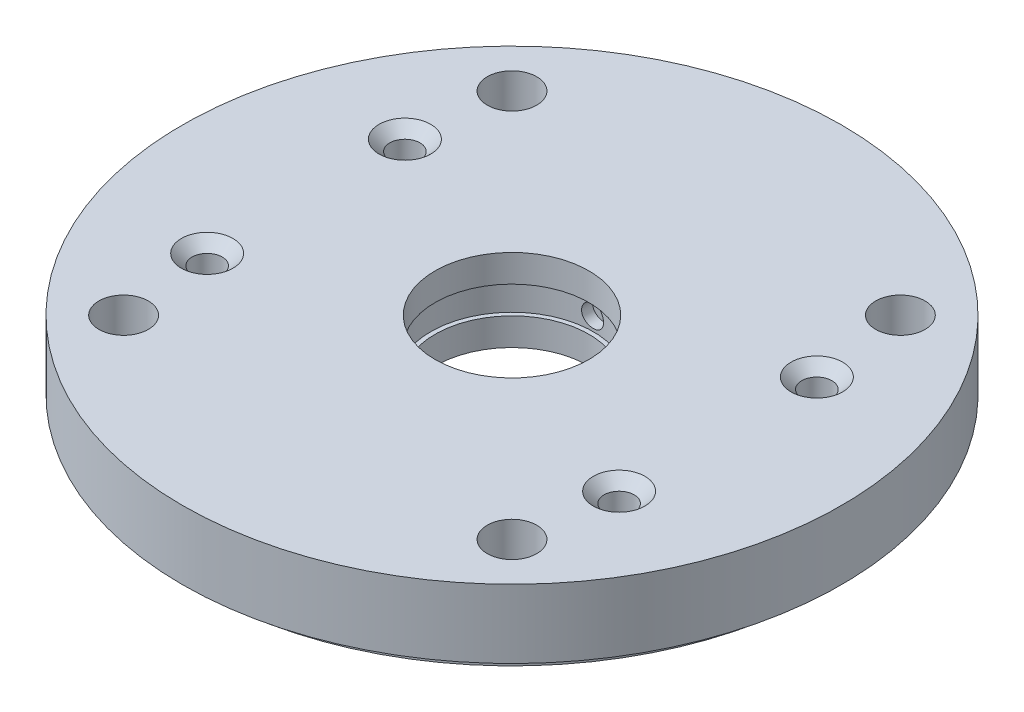
ISO-10303-21;
HEADER;
FILE_DESCRIPTION(('STEP AP214'),'2;1');
FILE_NAME('part.step','',(''),(''),'','','');
FILE_SCHEMA(('AUTOMOTIVE_DESIGN { 1 0 10303 214 1 1 1 1 }'));
ENDSEC;
DATA;
#1=APPLICATION_CONTEXT('core data for automotive mechanical design processes');
#2=APPLICATION_PROTOCOL_DEFINITION('international standard','automotive_design',2000,#1);
#3=PRODUCT_CONTEXT('',#1,'mechanical');
#4=PRODUCT('Part','Part','',(#3));
#5=PRODUCT_RELATED_PRODUCT_CATEGORY('part','',(#4));
#6=PRODUCT_DEFINITION_FORMATION('','',#4);
#7=PRODUCT_DEFINITION_CONTEXT('part definition',#1,'design');
#8=PRODUCT_DEFINITION('design','',#6,#7);
#9=PRODUCT_DEFINITION_SHAPE('','',#8);
#10=(LENGTH_UNIT() NAMED_UNIT(*) SI_UNIT(.MILLI.,.METRE.));
#11=(NAMED_UNIT(*) PLANE_ANGLE_UNIT() SI_UNIT($,.RADIAN.));
#12=(NAMED_UNIT(*) SI_UNIT($,.STERADIAN.) SOLID_ANGLE_UNIT());
#13=UNCERTAINTY_MEASURE_WITH_UNIT(LENGTH_MEASURE(1.E-05),#10,'distance_accuracy_value','');
#14=(GEOMETRIC_REPRESENTATION_CONTEXT(3) GLOBAL_UNCERTAINTY_ASSIGNED_CONTEXT((#13)) GLOBAL_UNIT_ASSIGNED_CONTEXT((#10,
#11,#12)) REPRESENTATION_CONTEXT('',''));
#15=CARTESIAN_POINT('',(0.,0.,0.));
#16=DIRECTION('',(0.,0.,1.));
#17=DIRECTION('',(1.,0.,0.));
#18=AXIS2_PLACEMENT_3D('',#15,#16,#17);
#19=CARTESIAN_POINT('',(0.,-2.5,0.));
#20=DIRECTION('',(0.,1.,0.));
#21=DIRECTION('',(0.,0.,1.));
#22=AXIS2_PLACEMENT_3D('',#19,#20,#21);
#23=CYLINDRICAL_SURFACE('',#22,14.8);
#24=CARTESIAN_POINT('',(0.,-2.5,0.));
#25=DIRECTION('',(0.,1.,0.));
#26=DIRECTION('',(0.,0.,1.));
#27=AXIS2_PLACEMENT_3D('',#24,#25,#26);
#28=CIRCLE('',#27,14.8);
#29=CARTESIAN_POINT('',(0.,-2.5,14.8));
#30=VERTEX_POINT('',#29);
#31=EDGE_CURVE('E59',#30,#30,#28,.T.);
#32=ORIENTED_EDGE('',*,*,#31,.F.);
#33=EDGE_LOOP('',(#32));
#34=FACE_BOUND('',#33,.T.);
#35=CARTESIAN_POINT('',(0.,2.5,0.));
#36=DIRECTION('',(0.,1.,0.));
#37=DIRECTION('',(0.,0.,1.));
#38=AXIS2_PLACEMENT_3D('',#35,#36,#37);
#39=CIRCLE('',#38,14.8);
#40=CARTESIAN_POINT('',(0.,2.5,14.8));
#41=VERTEX_POINT('',#40);
#42=EDGE_CURVE('E128',#41,#41,#39,.T.);
#43=ORIENTED_EDGE('',*,*,#42,.T.);
#44=EDGE_LOOP('',(#43));
#45=FACE_BOUND('',#44,.T.);
#46=CARTESIAN_POINT('',(-2.,0.,-14.6642422238587));
#47=CARTESIAN_POINT('',(-1.99999529578587,-0.111789206027057,-14.6642439407866));
#48=CARTESIAN_POINT('',(-1.99059572714212,-0.223646375467716,-14.6655343330712));
#49=CARTESIAN_POINT('',(-1.95325073253241,-0.444242193801103,-14.670553938447));
#50=CARTESIAN_POINT('',(-1.92528642224589,-0.552977549522505,-14.6742856348113));
#51=CARTESIAN_POINT('',(-1.8516561967299,-0.764104249434412,-14.6837576321533));
#52=CARTESIAN_POINT('',(-1.80600289769559,-0.866500054906773,-14.6894965012858));
#53=CARTESIAN_POINT('',(-1.69831872993679,-1.06216008351143,-14.7023345055794));
#54=CARTESIAN_POINT('',(-1.63629045083665,-1.15542574733752,-14.7094334256063));
#55=CARTESIAN_POINT('',(-1.49718446195897,-1.33080340222723,-14.7242434594185));
#56=CARTESIAN_POINT('',(-1.42002117228851,-1.41284724011534,-14.7319578991606));
#57=CARTESIAN_POINT('',(-1.25302005026385,-1.56286286381146,-14.7470999322923));
#58=CARTESIAN_POINT('',(-1.16318156288561,-1.63083392192353,-14.7545275108323));
#59=CARTESIAN_POINT('',(-0.972948400654116,-1.75102192358299,-14.7682933030086));
#60=CARTESIAN_POINT('',(-0.87251413147463,-1.80317673642567,-14.7746271793963));
#61=CARTESIAN_POINT('',(-0.664212082875051,-1.88985352912222,-14.7854552383821));
#62=CARTESIAN_POINT('',(-0.556344624248892,-1.92437626938271,-14.7899495003143));
#63=CARTESIAN_POINT('',(-0.336937385894213,-1.97460407507685,-14.796568506601));
#64=CARTESIAN_POINT('',(-0.2254240686656,-1.99042281921608,-14.7987075598605));
#65=CARTESIAN_POINT('',(-0.00130658082203191,-2.00314616261992,-14.8004240695127));
#66=CARTESIAN_POINT('',(0.111297539828156,-2.00005162416445,-14.8000016426865));
#67=CARTESIAN_POINT('',(0.333625960086138,-1.97512681206038,-14.7966543092344));
#68=CARTESIAN_POINT('',(0.44336424815575,-1.95341881198866,-14.7937457347353));
#69=CARTESIAN_POINT('',(0.657625951591038,-1.89207472982094,-14.7857711744686));
#70=CARTESIAN_POINT('',(0.762149253892653,-1.85243825921217,-14.7807051419487));
#71=CARTESIAN_POINT('',(0.963389245623299,-1.75623421281881,-14.7689567352304));
#72=CARTESIAN_POINT('',(1.06008060101127,-1.69961427684651,-14.762269374867));
#73=CARTESIAN_POINT('',(1.24263567066565,-1.57108867088602,-14.7480254013326));
#74=CARTESIAN_POINT('',(1.32849880469172,-1.49918218230769,-14.7404687416209));
#75=CARTESIAN_POINT('',(1.48767939507609,-1.34144118747187,-14.725259502793));
#76=CARTESIAN_POINT('',(1.56089118777377,-1.25550003995744,-14.7176066395955));
#77=CARTESIAN_POINT('',(1.6918681733103,-1.07249406202839,-14.7031268072317));
#78=CARTESIAN_POINT('',(1.74963330179108,-0.97542918526948,-14.6962998415067));
#79=CARTESIAN_POINT('',(1.8480863984276,-0.772830795802746,-14.6842449623788));
#80=CARTESIAN_POINT('',(1.88876498530745,-0.667292668677439,-14.6790179278359));
#81=CARTESIAN_POINT('',(1.9517917706359,-0.450796685786435,-14.6707712337009));
#82=CARTESIAN_POINT('',(1.97414100764296,-0.339839137467833,-14.6677514490448));
#83=CARTESIAN_POINT('',(1.99973284108136,-0.116589845541708,-14.6642843923551));
#84=CARTESIAN_POINT('',(2.00312455380969,-0.00431549598699867,-14.6638170440091));
#85=CARTESIAN_POINT('',(1.99109936375072,0.219199875164322,-14.6654546026568));
#86=CARTESIAN_POINT('',(1.97568293148719,0.330440922540928,-14.667559445302));
#87=CARTESIAN_POINT('',(1.92660497787309,0.548279318610916,-14.674085858685));
#88=CARTESIAN_POINT('',(1.89301646048659,0.654893416641846,-14.6784981571703));
#89=CARTESIAN_POINT('',(1.80862324181559,0.860977130088984,-14.6891347663274));
#90=CARTESIAN_POINT('',(1.75781784002699,0.960446454605884,-14.6953591507262));
#91=CARTESIAN_POINT('',(1.64006961992967,1.15008932533665,-14.7089663946664));
#92=CARTESIAN_POINT('',(1.5730294974432,1.24020195345439,-14.7163561420588));
#93=CARTESIAN_POINT('',(1.42485152792593,1.40795011125592,-14.7314401993318));
#94=CARTESIAN_POINT('',(1.34371303775914,1.48558507142527,-14.739134523094));
#95=CARTESIAN_POINT('',(1.16898810331941,1.62670243514653,-14.7540228717902));
#96=CARTESIAN_POINT('',(1.07532189873812,1.69008652976689,-14.7612131992535));
#97=CARTESIAN_POINT('',(0.878585491628291,1.80022089364369,-14.7742273072731));
#98=CARTESIAN_POINT('',(0.775515505547851,1.84697154563299,-14.7800511192716));
#99=CARTESIAN_POINT('',(0.563216372681455,1.92235161424481,-14.7896596863114));
#100=CARTESIAN_POINT('',(0.454007274180482,1.95103666399582,-14.7934506959679));
#101=CARTESIAN_POINT('',(0.232267848176888,1.98965191245769,-14.7985926004645));
#102=CARTESIAN_POINT('',(0.119737697365194,1.99958310711509,-14.7999436248828));
#103=CARTESIAN_POINT('',(-0.104492116428674,2.00038793796832,-14.800052461997));
#104=CARTESIAN_POINT('',(-0.21619125683872,1.99141270529086,-14.7988308395213));
#105=CARTESIAN_POINT('',(-0.436477519972148,1.95498102415107,-14.7939727361505));
#106=CARTESIAN_POINT('',(-0.545064647578227,1.92752460468707,-14.7903362590445));
#107=CARTESIAN_POINT('',(-0.756016275547837,1.85495982137742,-14.7810551256117));
#108=CARTESIAN_POINT('',(-0.858383743191857,1.80985995250338,-14.7754114358368));
#109=CARTESIAN_POINT('',(-1.0541217593421,1.7033042484448,-14.7627388567654));
#110=CARTESIAN_POINT('',(-1.14749212852395,1.64184808734898,-14.7557099398681));
#111=CARTESIAN_POINT('',(-1.32335568077786,1.50376978983375,-14.74098329435));
#112=CARTESIAN_POINT('',(-1.40576040128395,1.42703547560042,-14.7332808703501));
#113=CARTESIAN_POINT('',(-1.55658079211531,1.26081397217681,-14.7181118753614));
#114=CARTESIAN_POINT('',(-1.62499315875848,1.17132377968802,-14.7106453604232));
#115=CARTESIAN_POINT('',(-1.74615707157483,0.981661686414926,-14.696757556328));
#116=CARTESIAN_POINT('',(-1.7988364821515,0.881443362349709,-14.6903411407858));
#117=CARTESIAN_POINT('',(-1.88654028972702,0.673547985707742,-14.6793370684491));
#118=CARTESIAN_POINT('',(-1.92158355240822,0.565879044077429,-14.674747458594));
#119=CARTESIAN_POINT('',(-1.96479702094079,0.381399961469509,-14.6690104760282));
#120=CARTESIAN_POINT('',(-1.97797869556822,0.305744766251739,-14.6672315043511));
#121=CARTESIAN_POINT('',(-1.99558175777549,0.153403710415408,-14.6648467946852));
#122=CARTESIAN_POINT('',(-2.00000322837286,0.076717859570962,-14.6642410455782));
#123=CARTESIAN_POINT('',(-2.,0.,-14.6642422238587));
#124=B_SPLINE_CURVE_WITH_KNOTS('',3,(#46,#47,#48,#49,#50,#51,#52,#53,#54,#55,#56,#57,#58,#59,
#60,#61,#62,#63,#64,#65,#66,#67,#68,#69,#70,#71,#72,#73,#74,#75,#76,#77,#78,#79,#80,#81,#82,#83,
#84,#85,#86,#87,#88,#89,#90,#91,#92,#93,#94,#95,#96,#97,#98,#99,#100,#101,#102,#103,#104,#105,
#106,#107,#108,#109,#110,#111,#112,#113,#114,#115,#116,#117,#118,#119,#120,#121,#122,#123),
.UNSPECIFIED.,.T.,.F.,(4,2,2,2,2,2,2,2,2,2,2,2,2,2,2,2,2,2,2,2,2,2,2,2,2,2,2,2,2,2,2,2,2,2,2,2,
2,2,4),(0.,0.335087300046434,0.670515979029476,1.00570586160471,1.3408427672339,
1.67793235102471,2.01503936118698,2.35345396302519,2.6918539690502,3.02818650705442,
3.36450371135731,3.69862839557102,4.03276032066605,4.36793315475953,4.70312394177703,
5.04099151075062,5.37886048741776,5.71691472755546,6.05494981189334,6.39032219395862,
6.72568618617755,7.05971279493041,7.39375299587,7.7298471274463,8.06595659491222,
8.40431803494195,8.7426716888251,9.07997821915832,9.41726683590973,9.75186952490266,
10.0864716888806,10.420912946428,10.7553608684646,11.0923615498155,11.4294417075121,
11.7680444528262,12.1062842151069,12.336247598554,12.5662088027042),.UNSPECIFIED.);
#125=CARTESIAN_POINT('',(-2.,0.,-14.6642422238587));
#126=VERTEX_POINT('',#125);
#127=EDGE_CURVE('E38',#126,#126,#124,.T.);
#128=ORIENTED_EDGE('',*,*,#127,.F.);
#129=EDGE_LOOP('',(#128));
#130=FACE_BOUND('',#129,.T.);
#131=ADVANCED_FACE('F34',(#34,#45,#130),#23,.F.);
#132=CARTESIAN_POINT('',(0.,-7.5,0.));
#133=DIRECTION('',(0.,1.,0.));
#134=DIRECTION('',(0.,0.,1.));
#135=AXIS2_PLACEMENT_3D('',#132,#133,#134);
#136=CYLINDRICAL_SURFACE('',#135,14.);
#137=CARTESIAN_POINT('',(0.,-7.5,0.));
#138=DIRECTION('',(0.,1.,0.));
#139=DIRECTION('',(0.,0.,1.));
#140=AXIS2_PLACEMENT_3D('',#137,#138,#139);
#141=CIRCLE('',#140,14.);
#142=CARTESIAN_POINT('',(0.,-7.5,14.));
#143=VERTEX_POINT('',#142);
#144=EDGE_CURVE('E65',#143,#143,#141,.T.);
#145=ORIENTED_EDGE('',*,*,#144,.F.);
#146=EDGE_LOOP('',(#145));
#147=FACE_BOUND('',#146,.T.);
#148=CARTESIAN_POINT('',(0.,-2.5,0.));
#149=DIRECTION('',(0.,1.,0.));
#150=DIRECTION('',(0.,0.,1.));
#151=AXIS2_PLACEMENT_3D('',#148,#149,#150);
#152=CIRCLE('',#151,14.);
#153=CARTESIAN_POINT('',(0.,-2.5,14.));
#154=VERTEX_POINT('',#153);
#155=EDGE_CURVE('E58',#154,#154,#152,.F.);
#156=ORIENTED_EDGE('',*,*,#155,.F.);
#157=EDGE_LOOP('',(#156));
#158=FACE_BOUND('',#157,.T.);
#159=ADVANCED_FACE('F97',(#147,#158),#136,.F.);
#160=CARTESIAN_POINT('',(0.,7.5,0.));
#161=DIRECTION('',(0.,-1.,0.));
#162=DIRECTION('',(0.,0.,-1.));
#163=AXIS2_PLACEMENT_3D('',#160,#161,#162);
#164=CYLINDRICAL_SURFACE('',#163,57.);
#165=CARTESIAN_POINT('',(0.,-7.5,0.));
#166=DIRECTION('',(0.,1.,0.));
#167=DIRECTION('',(0.,0.,1.));
#168=AXIS2_PLACEMENT_3D('',#165,#166,#167);
#169=CIRCLE('',#168,57.);
#170=CARTESIAN_POINT('',(0.,-7.5,57.));
#171=VERTEX_POINT('',#170);
#172=EDGE_CURVE('E47',#171,#171,#169,.T.);
#173=ORIENTED_EDGE('',*,*,#172,.T.);
#174=EDGE_LOOP('',(#173));
#175=FACE_BOUND('',#174,.T.);
#176=CARTESIAN_POINT('',(0.,-5.,0.));
#177=DIRECTION('',(0.,1.,0.));
#178=DIRECTION('',(0.,0.,1.));
#179=AXIS2_PLACEMENT_3D('',#176,#177,#178);
#180=CIRCLE('',#179,57.);
#181=CARTESIAN_POINT('',(0.,-5.,57.));
#182=VERTEX_POINT('',#181);
#183=EDGE_CURVE('E12',#182,#182,#180,.T.);
#184=ORIENTED_EDGE('',*,*,#183,.F.);
#185=EDGE_LOOP('',(#184));
#186=FACE_BOUND('',#185,.T.);
#187=ADVANCED_FACE('F36',(#175,#186),#164,.T.);
#188=CARTESIAN_POINT('',(0.,-7.5,0.));
#189=DIRECTION('',(0.,1.,0.));
#190=DIRECTION('',(0.,0.,1.));
#191=AXIS2_PLACEMENT_3D('',#188,#189,#190);
#192=PLANE('',#191);
#193=CARTESIAN_POINT('',(37.4999999999999,-7.5,18.0000000000035));
#194=DIRECTION('',(0.,-1.,0.));
#195=DIRECTION('',(0.,0.,-1.));
#196=AXIS2_PLACEMENT_3D('',#193,#194,#195);
#197=CIRCLE('',#196,2.75);
#198=CARTESIAN_POINT('',(37.4999999999999,-7.5,15.2500000000035));
#199=VERTEX_POINT('',#198);
#200=EDGE_CURVE('E212',#199,#199,#197,.T.);
#201=ORIENTED_EDGE('',*,*,#200,.F.);
#202=EDGE_LOOP('',(#201));
#203=FACE_BOUND('',#202,.T.);
#204=CARTESIAN_POINT('',(37.5,-7.5,-17.9999999999965));
#205=DIRECTION('',(0.,-1.,0.));
#206=DIRECTION('',(0.,0.,-1.));
#207=AXIS2_PLACEMENT_3D('',#204,#205,#206);
#208=CIRCLE('',#207,2.75);
#209=CARTESIAN_POINT('',(37.5,-7.5,-20.7499999999965));
#210=VERTEX_POINT('',#209);
#211=EDGE_CURVE('E223',#210,#210,#208,.T.);
#212=ORIENTED_EDGE('',*,*,#211,.F.);
#213=EDGE_LOOP('',(#212));
#214=FACE_BOUND('',#213,.T.);
#215=CARTESIAN_POINT('',(-37.5000000000001,-7.5,-17.9999999999965));
#216=DIRECTION('',(0.,-1.,0.));
#217=DIRECTION('',(0.,0.,-1.));
#218=AXIS2_PLACEMENT_3D('',#215,#216,#217);
#219=CIRCLE('',#218,2.75);
#220=CARTESIAN_POINT('',(-37.5000000000001,-7.5,-20.7499999999965));
#221=VERTEX_POINT('',#220);
#222=EDGE_CURVE('E232',#221,#221,#219,.T.);
#223=ORIENTED_EDGE('',*,*,#222,.F.);
#224=EDGE_LOOP('',(#223));
#225=FACE_BOUND('',#224,.T.);
#226=CARTESIAN_POINT('',(-37.5,-7.5,18.0000000000035));
#227=DIRECTION('',(0.,-1.,0.));
#228=DIRECTION('',(0.,0.,-1.));
#229=AXIS2_PLACEMENT_3D('',#226,#227,#228);
#230=CIRCLE('',#229,2.75);
#231=CARTESIAN_POINT('',(-37.5,-7.5,15.2500000000035));
#232=VERTEX_POINT('',#231);
#233=EDGE_CURVE('E241',#232,#232,#230,.T.);
#234=ORIENTED_EDGE('',*,*,#233,.F.);
#235=EDGE_LOOP('',(#234));
#236=FACE_BOUND('',#235,.T.);
#237=CARTESIAN_POINT('',(35.3553390593272,-7.5,35.3553390593275));
#238=DIRECTION('',(0.,1.,0.));
#239=DIRECTION('',(0.,0.,1.));
#240=AXIS2_PLACEMENT_3D('',#237,#238,#239);
#241=CIRCLE('',#240,4.49999999999999);
#242=CARTESIAN_POINT('',(35.3553390593272,-7.5,39.8553390593275));
#243=VERTEX_POINT('',#242);
#244=EDGE_CURVE('E250',#243,#243,#241,.T.);
#245=ORIENTED_EDGE('',*,*,#244,.T.);
#246=EDGE_LOOP('',(#245));
#247=FACE_BOUND('',#246,.T.);
#248=CARTESIAN_POINT('',(35.3553390593272,-7.5,-35.3553390593276));
#249=DIRECTION('',(0.,1.,0.));
#250=DIRECTION('',(0.,0.,1.));
#251=AXIS2_PLACEMENT_3D('',#248,#249,#250);
#252=CIRCLE('',#251,4.49999999999998);
#253=CARTESIAN_POINT('',(35.3553390593272,-7.5,-30.8553390593276));
#254=VERTEX_POINT('',#253);
#255=EDGE_CURVE('E256',#254,#254,#252,.T.);
#256=ORIENTED_EDGE('',*,*,#255,.T.);
#257=EDGE_LOOP('',(#256));
#258=FACE_BOUND('',#257,.T.);
#259=CARTESIAN_POINT('',(-35.3553390593275,-7.5,-35.3553390593273));
#260=DIRECTION('',(0.,1.,0.));
#261=DIRECTION('',(0.,0.,1.));
#262=AXIS2_PLACEMENT_3D('',#259,#260,#261);
#263=CIRCLE('',#262,4.49999999999999);
#264=CARTESIAN_POINT('',(-35.3553390593275,-7.5,-30.8553390593273));
#265=VERTEX_POINT('',#264);
#266=EDGE_CURVE('E262',#265,#265,#263,.T.);
#267=ORIENTED_EDGE('',*,*,#266,.T.);
#268=EDGE_LOOP('',(#267));
#269=FACE_BOUND('',#268,.T.);
#270=CARTESIAN_POINT('',(-35.3553390593272,-7.5,35.3553390593276));
#271=DIRECTION('',(0.,1.,0.));
#272=DIRECTION('',(0.,0.,1.));
#273=AXIS2_PLACEMENT_3D('',#270,#271,#272);
#274=CIRCLE('',#273,4.49999999999999);
#275=CARTESIAN_POINT('',(-35.3553390593272,-7.5,39.8553390593276));
#276=VERTEX_POINT('',#275);
#277=EDGE_CURVE('E140',#276,#276,#274,.T.);
#278=ORIENTED_EDGE('',*,*,#277,.T.);
#279=EDGE_LOOP('',(#278));
#280=FACE_BOUND('',#279,.T.);
#281=ORIENTED_EDGE('',*,*,#144,.T.);
#282=EDGE_LOOP('',(#281));
#283=FACE_BOUND('',#282,.T.);
#284=ORIENTED_EDGE('',*,*,#172,.F.);
#285=EDGE_LOOP('',(#284));
#286=FACE_BOUND('',#285,.T.);
#287=ADVANCED_FACE('F93',(#203,#214,#225,#236,#247,#258,#269,#280,#283,#286),#192,.F.);
#288=CARTESIAN_POINT('',(0.,-5.,0.));
#289=DIRECTION('',(0.,1.,0.));
#290=DIRECTION('',(0.,0.,1.));
#291=AXIS2_PLACEMENT_3D('',#288,#289,#290);
#292=CYLINDRICAL_SURFACE('',#291,60.);
#293=CARTESIAN_POINT('',(0.,-5.,0.));
#294=DIRECTION('',(0.,1.,0.));
#295=DIRECTION('',(0.,0.,1.));
#296=AXIS2_PLACEMENT_3D('',#293,#294,#295);
#297=CIRCLE('',#296,60.);
#298=CARTESIAN_POINT('',(0.,-5.,60.));
#299=VERTEX_POINT('',#298);
#300=EDGE_CURVE('E52',#299,#299,#297,.T.);
#301=ORIENTED_EDGE('',*,*,#300,.T.);
#302=EDGE_LOOP('',(#301));
#303=FACE_BOUND('',#302,.T.);
#304=CARTESIAN_POINT('',(0.,7.5,0.));
#305=DIRECTION('',(0.,1.,0.));
#306=DIRECTION('',(0.,0.,1.));
#307=AXIS2_PLACEMENT_3D('',#304,#305,#306);
#308=CIRCLE('',#307,60.);
#309=CARTESIAN_POINT('',(0.,7.5,60.));
#310=VERTEX_POINT('',#309);
#311=EDGE_CURVE('E70',#310,#310,#308,.T.);
#312=ORIENTED_EDGE('',*,*,#311,.F.);
#313=EDGE_LOOP('',(#312));
#314=FACE_BOUND('',#313,.T.);
#315=ADVANCED_FACE('F78',(#303,#314),#292,.T.);
#316=CARTESIAN_POINT('',(0.,-5.,0.));
#317=DIRECTION('',(0.,1.,0.));
#318=DIRECTION('',(0.,0.,1.));
#319=AXIS2_PLACEMENT_3D('',#316,#317,#318);
#320=PLANE('',#319);
#321=ORIENTED_EDGE('',*,*,#183,.T.);
#322=EDGE_LOOP('',(#321));
#323=FACE_BOUND('',#322,.T.);
#324=ORIENTED_EDGE('',*,*,#300,.F.);
#325=EDGE_LOOP('',(#324));
#326=FACE_BOUND('',#325,.T.);
#327=ADVANCED_FACE('F81',(#323,#326),#320,.F.);
#328=CARTESIAN_POINT('',(0.,7.5,0.));
#329=DIRECTION('',(0.,1.,0.));
#330=DIRECTION('',(0.,0.,1.));
#331=AXIS2_PLACEMENT_3D('',#328,#329,#330);
#332=PLANE('',#331);
#333=CARTESIAN_POINT('',(37.4999999999999,7.5,18.0000000000035));
#334=DIRECTION('',(0.,-1.,0.));
#335=DIRECTION('',(0.,0.,-1.));
#336=AXIS2_PLACEMENT_3D('',#333,#334,#335);
#337=CIRCLE('',#336,4.7);
#338=CARTESIAN_POINT('',(37.4999999999999,7.5,13.3000000000035));
#339=VERTEX_POINT('',#338);
#340=EDGE_CURVE('E214',#339,#339,#337,.T.);
#341=ORIENTED_EDGE('',*,*,#340,.T.);
#342=EDGE_LOOP('',(#341));
#343=FACE_BOUND('',#342,.T.);
#344=CARTESIAN_POINT('',(37.5,7.5,-17.9999999999965));
#345=DIRECTION('',(0.,-1.,0.));
#346=DIRECTION('',(0.,0.,-1.));
#347=AXIS2_PLACEMENT_3D('',#344,#345,#346);
#348=CIRCLE('',#347,4.7);
#349=CARTESIAN_POINT('',(37.5,7.5,-22.6999999999965));
#350=VERTEX_POINT('',#349);
#351=EDGE_CURVE('E216',#350,#350,#348,.T.);
#352=ORIENTED_EDGE('',*,*,#351,.T.);
#353=EDGE_LOOP('',(#352));
#354=FACE_BOUND('',#353,.T.);
#355=CARTESIAN_POINT('',(-37.5000000000001,7.5,-17.9999999999965));
#356=DIRECTION('',(0.,-1.,0.));
#357=DIRECTION('',(0.,0.,-1.));
#358=AXIS2_PLACEMENT_3D('',#355,#356,#357);
#359=CIRCLE('',#358,4.7);
#360=CARTESIAN_POINT('',(-37.5000000000001,7.5,-22.6999999999965));
#361=VERTEX_POINT('',#360);
#362=EDGE_CURVE('E229',#361,#361,#359,.T.);
#363=ORIENTED_EDGE('',*,*,#362,.T.);
#364=EDGE_LOOP('',(#363));
#365=FACE_BOUND('',#364,.T.);
#366=CARTESIAN_POINT('',(-37.5,7.5,18.0000000000035));
#367=DIRECTION('',(0.,-1.,0.));
#368=DIRECTION('',(0.,0.,-1.));
#369=AXIS2_PLACEMENT_3D('',#366,#367,#368);
#370=CIRCLE('',#369,4.7);
#371=CARTESIAN_POINT('',(-37.5,7.5,13.3000000000035));
#372=VERTEX_POINT('',#371);
#373=EDGE_CURVE('E238',#372,#372,#370,.T.);
#374=ORIENTED_EDGE('',*,*,#373,.T.);
#375=EDGE_LOOP('',(#374));
#376=FACE_BOUND('',#375,.T.);
#377=CARTESIAN_POINT('',(35.3553390593272,7.5,35.3553390593275));
#378=DIRECTION('',(0.,1.,0.));
#379=DIRECTION('',(0.,0.,1.));
#380=AXIS2_PLACEMENT_3D('',#377,#378,#379);
#381=CIRCLE('',#380,4.49999999999999);
#382=CARTESIAN_POINT('',(35.3553390593272,7.5,39.8553390593275));
#383=VERTEX_POINT('',#382);
#384=EDGE_CURVE('E247',#383,#383,#381,.T.);
#385=ORIENTED_EDGE('',*,*,#384,.F.);
#386=EDGE_LOOP('',(#385));
#387=FACE_BOUND('',#386,.T.);
#388=CARTESIAN_POINT('',(35.3553390593272,7.5,-35.3553390593276));
#389=DIRECTION('',(0.,1.,0.));
#390=DIRECTION('',(0.,0.,1.));
#391=AXIS2_PLACEMENT_3D('',#388,#389,#390);
#392=CIRCLE('',#391,4.49999999999999);
#393=CARTESIAN_POINT('',(35.3553390593272,7.5,-30.8553390593276));
#394=VERTEX_POINT('',#393);
#395=EDGE_CURVE('E253',#394,#394,#392,.T.);
#396=ORIENTED_EDGE('',*,*,#395,.F.);
#397=EDGE_LOOP('',(#396));
#398=FACE_BOUND('',#397,.T.);
#399=CARTESIAN_POINT('',(-35.3553390593275,7.5,-35.3553390593273));
#400=DIRECTION('',(0.,1.,0.));
#401=DIRECTION('',(0.,0.,1.));
#402=AXIS2_PLACEMENT_3D('',#399,#400,#401);
#403=CIRCLE('',#402,4.49999999999999);
#404=CARTESIAN_POINT('',(-35.3553390593275,7.5,-30.8553390593273));
#405=VERTEX_POINT('',#404);
#406=EDGE_CURVE('E259',#405,#405,#403,.T.);
#407=ORIENTED_EDGE('',*,*,#406,.F.);
#408=EDGE_LOOP('',(#407));
#409=FACE_BOUND('',#408,.T.);
#410=CARTESIAN_POINT('',(-35.3553390593272,7.5,35.3553390593276));
#411=DIRECTION('',(0.,1.,0.));
#412=DIRECTION('',(0.,0.,1.));
#413=AXIS2_PLACEMENT_3D('',#410,#411,#412);
#414=CIRCLE('',#413,4.49999999999999);
#415=CARTESIAN_POINT('',(-35.3553390593272,7.5,39.8553390593276));
#416=VERTEX_POINT('',#415);
#417=EDGE_CURVE('E264',#416,#416,#414,.T.);
#418=ORIENTED_EDGE('',*,*,#417,.F.);
#419=EDGE_LOOP('',(#418));
#420=FACE_BOUND('',#419,.T.);
#421=CARTESIAN_POINT('',(0.,7.5,0.));
#422=DIRECTION('',(0.,1.,0.));
#423=DIRECTION('',(0.,0.,1.));
#424=AXIS2_PLACEMENT_3D('',#421,#422,#423);
#425=CIRCLE('',#424,14.);
#426=CARTESIAN_POINT('',(0.,7.5,14.));
#427=VERTEX_POINT('',#426);
#428=EDGE_CURVE('E61',#427,#427,#425,.T.);
#429=ORIENTED_EDGE('',*,*,#428,.F.);
#430=EDGE_LOOP('',(#429));
#431=FACE_BOUND('',#430,.T.);
#432=ORIENTED_EDGE('',*,*,#311,.T.);
#433=EDGE_LOOP('',(#432));
#434=FACE_BOUND('',#433,.T.);
#435=ADVANCED_FACE('F83',(#343,#354,#365,#376,#387,#398,#409,#420,#431,#434),#332,.T.);
#436=CARTESIAN_POINT('',(0.,2.5,0.));
#437=DIRECTION('',(0.,1.,0.));
#438=DIRECTION('',(0.,0.,1.));
#439=AXIS2_PLACEMENT_3D('',#436,#437,#438);
#440=CIRCLE('',#439,14.);
#441=CARTESIAN_POINT('',(0.,2.5,14.));
#442=VERTEX_POINT('',#441);
#443=EDGE_CURVE('E56',#442,#442,#440,.F.);
#444=ORIENTED_EDGE('',*,*,#443,.T.);
#445=EDGE_LOOP('',(#444));
#446=FACE_BOUND('',#445,.T.);
#447=ORIENTED_EDGE('',*,*,#428,.T.);
#448=EDGE_LOOP('',(#447));
#449=FACE_BOUND('',#448,.T.);
#450=ADVANCED_FACE('F90',(#446,#449),#136,.F.);
#451=CARTESIAN_POINT('',(0.,-2.5,0.));
#452=DIRECTION('',(0.,1.,0.));
#453=DIRECTION('',(0.,0.,1.));
#454=AXIS2_PLACEMENT_3D('',#451,#452,#453);
#455=PLANE('',#454);
#456=ORIENTED_EDGE('',*,*,#31,.T.);
#457=EDGE_LOOP('',(#456));
#458=FACE_BOUND('',#457,.T.);
#459=ORIENTED_EDGE('',*,*,#155,.T.);
#460=EDGE_LOOP('',(#459));
#461=FACE_BOUND('',#460,.T.);
#462=ADVANCED_FACE('F110',(#458,#461),#455,.T.);
#463=CARTESIAN_POINT('',(0.,2.5,0.));
#464=DIRECTION('',(0.,1.,0.));
#465=DIRECTION('',(0.,0.,1.));
#466=AXIS2_PLACEMENT_3D('',#463,#464,#465);
#467=PLANE('',#466);
#468=ORIENTED_EDGE('',*,*,#42,.F.);
#469=EDGE_LOOP('',(#468));
#470=FACE_BOUND('',#469,.T.);
#471=ORIENTED_EDGE('',*,*,#443,.F.);
#472=EDGE_LOOP('',(#471));
#473=FACE_BOUND('',#472,.T.);
#474=ADVANCED_FACE('F107',(#470,#473),#467,.F.);
#475=CARTESIAN_POINT('',(0.,0.,0.));
#476=DIRECTION('',(0.,0.,-1.));
#477=DIRECTION('',(-1.,0.,0.));
#478=AXIS2_PLACEMENT_3D('',#475,#476,#477);
#479=CYLINDRICAL_SURFACE('',#478,2.);
#480=CARTESIAN_POINT('',(-2.,0.,-16.6805275695944));
#481=CARTESIAN_POINT('',(-1.99999521702773,0.111912981585463,-16.6805291092761));
#482=CARTESIAN_POINT('',(-1.99057493231366,0.223896956898408,-16.6816659945707));
#483=CARTESIAN_POINT('',(-1.95314278109255,0.444751409679772,-16.6860892594404));
#484=CARTESIAN_POINT('',(-1.92511121322589,0.553618460137015,-16.6893779167647));
#485=CARTESIAN_POINT('',(-1.85129194973763,0.765009297081991,-16.6977270664711));
#486=CARTESIAN_POINT('',(-1.8055159728756,0.867537218347731,-16.7027863892568));
#487=CARTESIAN_POINT('',(-1.69753176283812,1.06343573867555,-16.7141053957062));
#488=CARTESIAN_POINT('',(-1.63532645559683,1.15680796423862,-16.7203648655788));
#489=CARTESIAN_POINT('',(-1.49591000152839,1.33223974526355,-16.7334145654652));
#490=CARTESIAN_POINT('',(-1.41863197948155,1.41424599066587,-16.7402070771251));
#491=CARTESIAN_POINT('',(-1.25140749678603,1.5641578092307,-16.7535369537174));
#492=CARTESIAN_POINT('',(-1.1614604196144,1.63206269577093,-16.7600743062131));
#493=CARTESIAN_POINT('',(-0.971117864244538,1.75203392975217,-16.7721804623022));
#494=CARTESIAN_POINT('',(-0.87069191932479,1.80405226348228,-16.7777463084254));
#495=CARTESIAN_POINT('',(-0.662452619760682,1.89046635500461,-16.78725730882));
#496=CARTESIAN_POINT('',(-0.554639515052902,1.92486270868403,-16.7912025178923));
#497=CARTESIAN_POINT('',(-0.33523022317376,1.97489781433994,-16.797011667732));
#498=CARTESIAN_POINT('',(-0.223654462935962,1.99062498376776,-16.7988854160347));
#499=CARTESIAN_POINT('',(0.000567381914893939,2.00314919041165,-16.8003739828653));
#500=CARTESIAN_POINT('',(0.113213427973307,1.99994690695697,-16.7999888824575));
#501=CARTESIAN_POINT('',(0.335777020846232,1.97477420162867,-16.7970111003479));
#502=CARTESIAN_POINT('',(0.445705492864176,1.95289886571184,-16.7944296032416));
#503=CARTESIAN_POINT('',(0.660319812418084,1.89114952421506,-16.7873617132715));
#504=CARTESIAN_POINT('',(0.765005568164476,1.85127520363086,-16.7828752870693));
#505=CARTESIAN_POINT('',(0.966458562616065,1.75455785418354,-16.7724824383568));
#506=CARTESIAN_POINT('',(1.06320574550805,1.69767343748066,-16.766572559297));
#507=CARTESIAN_POINT('',(1.24581650098578,1.56858072673998,-16.7539945043923));
#508=CARTESIAN_POINT('',(1.33167962048523,1.49637179510135,-16.7473262970013));
#509=CARTESIAN_POINT('',(1.49064310679441,1.33814666413617,-16.7339295761398));
#510=CARTESIAN_POINT('',(1.56366104283431,1.25204763441093,-16.7272009450995));
#511=CARTESIAN_POINT('',(1.69422143926088,1.06877155993791,-16.7144826510327));
#512=CARTESIAN_POINT('',(1.75176385890509,0.971594486025873,-16.7084929899517));
#513=CARTESIAN_POINT('',(1.84974319317282,0.768849984494345,-16.6979307480532));
#514=CARTESIAN_POINT('',(1.89017389527848,0.663279526098194,-16.6933586820636));
#515=CARTESIAN_POINT('',(1.95271105490751,0.446781400042675,-16.6861595181879));
#516=CARTESIAN_POINT('',(1.97481831085083,0.335853966029357,-16.6835323355567));
#517=CARTESIAN_POINT('',(1.99997267812833,0.112517604660588,-16.6805357102454));
#518=CARTESIAN_POINT('',(2.00313561788459,0.000121900026810181,-16.6801525476071));
#519=CARTESIAN_POINT('',(1.9906168174558,-0.223597816465263,-16.6816510833524));
#520=CARTESIAN_POINT('',(1.97493544072991,-0.334921848951655,-16.6835327380535));
#521=CARTESIAN_POINT('',(1.92527051173379,-0.552993484102836,-16.6893363861405));
#522=CARTESIAN_POINT('',(1.89134270530046,-0.659753962311116,-16.6932521637117));
#523=CARTESIAN_POINT('',(1.80620526337886,-0.8660700836985,-16.7026778133762));
#524=CARTESIAN_POINT('',(1.7549950744246,-0.965625496012318,-16.7081877365211));
#525=CARTESIAN_POINT('',(1.63646036706895,-1.1552305281874,-16.720213809793));
#526=CARTESIAN_POINT('',(1.5690596851758,-1.24523223010878,-16.726734662531));
#527=CARTESIAN_POINT('',(1.42016530035133,-1.41268687813336,-16.740032943455));
#528=CARTESIAN_POINT('',(1.33867110108157,-1.49013938209905,-16.7468103806708));
#529=CARTESIAN_POINT('',(1.16339791207259,-1.63070200735862,-16.7599001517596));
#530=CARTESIAN_POINT('',(1.0695577772168,-1.69373615839748,-16.7662099087321));
#531=CARTESIAN_POINT('',(0.872555041327783,-1.80314785455925,-16.7776151236743));
#532=CARTESIAN_POINT('',(0.76939261314862,-1.84952570844412,-16.7827106041527));
#533=CARTESIAN_POINT('',(0.556929411775422,-1.92418201285919,-16.7911016607987));
#534=CARTESIAN_POINT('',(0.447644426329686,-1.95250487697047,-16.7944016507493));
#535=CARTESIAN_POINT('',(0.225828329860469,-1.99039183062441,-16.7988481838214));
#536=CARTESIAN_POINT('',(0.113297351123307,-1.999956683533,-16.7999948145748));
#537=CARTESIAN_POINT('',(-0.111073486272895,-2.0000427576687,-16.8000051187242));
#538=CARTESIAN_POINT('',(-0.222913317517294,-1.99068132239542,-16.7988828593011));
#539=CARTESIAN_POINT('',(-0.443418509101867,-1.95342845001661,-16.794509376336));
#540=CARTESIAN_POINT('',(-0.552083870274315,-1.92553701776927,-16.7912581533521));
#541=CARTESIAN_POINT('',(-0.763143794842564,-1.85205165617288,-16.782990552824));
#542=CARTESIAN_POINT('',(-0.865540144921187,-1.80646279807829,-16.7779746809841));
#543=CARTESIAN_POINT('',(-1.06124728305247,-1.69888885438346,-16.7667341448953));
#544=CARTESIAN_POINT('',(-1.15455800401709,-1.6369036477256,-16.7605094717216));
#545=CARTESIAN_POINT('',(-1.3300452988054,-1.49786059719657,-16.7475007177847));
#546=CARTESIAN_POINT('',(-1.41215240522587,-1.42071536415446,-16.7407135322533));
#547=CARTESIAN_POINT('',(-1.56230279421461,-1.25372219661915,-16.7273700142393));
#548=CARTESIAN_POINT('',(-1.63034273113475,-1.16387124881469,-16.7208137369815));
#549=CARTESIAN_POINT('',(-1.75062848818711,-0.973658587256594,-16.7086498205249));
#550=CARTESIAN_POINT('',(-1.8028180211501,-0.873261080667818,-16.7030455925263));
#551=CARTESIAN_POINT('',(-1.88952382817448,-0.665118493017267,-16.6934603883795));
#552=CARTESIAN_POINT('',(-1.92405950858009,-0.557381628229657,-16.689477630783));
#553=CARTESIAN_POINT('',(-1.96611971234091,-0.374227534341,-16.6845630694677));
#554=CARTESIAN_POINT('',(-1.97880678730024,-0.299969934804937,-16.6830571943502));
#555=CARTESIAN_POINT('',(-1.99574851138916,-0.15048558759586,-16.6810389300077));
#556=CARTESIAN_POINT('',(-2.00000321643629,-0.0752588463528398,-16.6805265341948));
#557=CARTESIAN_POINT('',(-2.,0.,-16.6805275695944));
#558=B_SPLINE_CURVE_WITH_KNOTS('',3,(#480,#481,#482,#483,#484,#485,#486,#487,#488,#489,#490,
#491,#492,#493,#494,#495,#496,#497,#498,#499,#500,#501,#502,#503,#504,#505,#506,#507,#508,#509,
#510,#511,#512,#513,#514,#515,#516,#517,#518,#519,#520,#521,#522,#523,#524,#525,#526,#527,#528,
#529,#530,#531,#532,#533,#534,#535,#536,#537,#538,#539,#540,#541,#542,#543,#544,#545,#546,#547,
#548,#549,#550,#551,#552,#553,#554,#555,#556,#557),.UNSPECIFIED.,.T.,.F.,(4,2,2,2,2,2,2,2,2,2,2,
2,2,2,2,2,2,2,2,2,2,2,2,2,2,2,2,2,2,2,2,2,2,2,2,2,2,2,4),(0.,0.335464038849132,
0.671283757503219,1.00688207097411,1.34242065728652,1.67948330579682,2.01656236268913,
2.35465031106137,2.69272682623577,3.02919573699581,3.3656525728278,3.70040627157822,
4.03516582915504,4.37074662238831,4.70634138073283,5.04401685387889,5.38169321601606,
5.71949206875788,6.0572762015873,6.39299294539448,6.7287032141796,7.06339361164216,
7.39809472853695,7.73440229495669,8.07072170770057,8.40877433717961,8.7468206997687,
9.08403225806479,9.42123009309588,9.75634370411969,10.0914572272835,10.4264747933868,
10.7614948330632,11.0985059379406,11.4355971034738,11.7738716984883,12.1117736344999,
12.3373668017853,12.5629584730908),.UNSPECIFIED.);
#559=CARTESIAN_POINT('',(-2.,0.,-16.6805275695944));
#560=VERTEX_POINT('',#559);
#561=EDGE_CURVE('E132',#560,#560,#558,.T.);
#562=ORIENTED_EDGE('',*,*,#561,.T.);
#563=EDGE_LOOP('',(#562));
#564=FACE_BOUND('',#563,.T.);
#565=ORIENTED_EDGE('',*,*,#127,.T.);
#566=EDGE_LOOP('',(#565));
#567=FACE_BOUND('',#566,.T.);
#568=ADVANCED_FACE('F119',(#564,#567),#479,.F.);
#569=CARTESIAN_POINT('',(0.,-2.5,0.));
#570=DIRECTION('',(0.,1.,0.));
#571=DIRECTION('',(0.,0.,1.));
#572=AXIS2_PLACEMENT_3D('',#569,#570,#571);
#573=CYLINDRICAL_SURFACE('',#572,16.8);
#574=ORIENTED_EDGE('',*,*,#561,.F.);
#575=EDGE_LOOP('',(#574));
#576=FACE_BOUND('',#575,.T.);
#577=ADVANCED_FACE('F124',(#576),#573,.F.);
#578=CARTESIAN_POINT('',(-35.3553390593272,7.5,35.3553390593276));
#579=DIRECTION('',(0.,1.,0.));
#580=DIRECTION('',(0.,0.,1.));
#581=AXIS2_PLACEMENT_3D('',#578,#579,#580);
#582=CYLINDRICAL_SURFACE('',#581,4.49999999999999);
#583=ORIENTED_EDGE('',*,*,#277,.F.);
#584=EDGE_LOOP('',(#583));
#585=FACE_BOUND('',#584,.T.);
#586=ORIENTED_EDGE('',*,*,#417,.T.);
#587=EDGE_LOOP('',(#586));
#588=FACE_BOUND('',#587,.T.);
#589=ADVANCED_FACE('F146',(#585,#588),#582,.F.);
#590=CARTESIAN_POINT('',(-35.3553390593275,7.5,-35.3553390593273));
#591=DIRECTION('',(0.,1.,0.));
#592=DIRECTION('',(0.,0.,1.));
#593=AXIS2_PLACEMENT_3D('',#590,#591,#592);
#594=CYLINDRICAL_SURFACE('',#593,4.49999999999999);
#595=ORIENTED_EDGE('',*,*,#266,.F.);
#596=EDGE_LOOP('',(#595));
#597=FACE_BOUND('',#596,.T.);
#598=ORIENTED_EDGE('',*,*,#406,.T.);
#599=EDGE_LOOP('',(#598));
#600=FACE_BOUND('',#599,.T.);
#601=ADVANCED_FACE('F151',(#597,#600),#594,.F.);
#602=CARTESIAN_POINT('',(35.3553390593272,7.5,-35.3553390593276));
#603=DIRECTION('',(0.,1.,0.));
#604=DIRECTION('',(0.,0.,1.));
#605=AXIS2_PLACEMENT_3D('',#602,#603,#604);
#606=CYLINDRICAL_SURFACE('',#605,4.49999999999999);
#607=ORIENTED_EDGE('',*,*,#255,.F.);
#608=EDGE_LOOP('',(#607));
#609=FACE_BOUND('',#608,.T.);
#610=ORIENTED_EDGE('',*,*,#395,.T.);
#611=EDGE_LOOP('',(#610));
#612=FACE_BOUND('',#611,.T.);
#613=ADVANCED_FACE('F160',(#609,#612),#606,.F.);
#614=CARTESIAN_POINT('',(35.3553390593272,7.5,35.3553390593275));
#615=DIRECTION('',(0.,1.,0.));
#616=DIRECTION('',(0.,0.,1.));
#617=AXIS2_PLACEMENT_3D('',#614,#615,#616);
#618=CYLINDRICAL_SURFACE('',#617,4.49999999999999);
#619=ORIENTED_EDGE('',*,*,#244,.F.);
#620=EDGE_LOOP('',(#619));
#621=FACE_BOUND('',#620,.T.);
#622=ORIENTED_EDGE('',*,*,#384,.T.);
#623=EDGE_LOOP('',(#622));
#624=FACE_BOUND('',#623,.T.);
#625=ADVANCED_FACE('F168',(#621,#624),#618,.F.);
#626=CARTESIAN_POINT('',(-37.5,5.54999999999999,18.0000000000035));
#627=DIRECTION('',(0.,1.,0.));
#628=DIRECTION('',(0.,0.,1.));
#629=AXIS2_PLACEMENT_3D('',#626,#627,#628);
#630=CONICAL_SURFACE('',#629,2.75,0.785398163397447);
#631=ORIENTED_EDGE('',*,*,#373,.F.);
#632=EDGE_LOOP('',(#631));
#633=FACE_BOUND('',#632,.T.);
#634=CARTESIAN_POINT('',(-37.5,5.54999999999999,18.0000000000035));
#635=DIRECTION('',(0.,-1.,0.));
#636=DIRECTION('',(0.,0.,-1.));
#637=AXIS2_PLACEMENT_3D('',#634,#635,#636);
#638=CIRCLE('',#637,2.75);
#639=CARTESIAN_POINT('',(-37.5,5.54999999999999,15.2500000000035));
#640=VERTEX_POINT('',#639);
#641=EDGE_CURVE('E244',#640,#640,#638,.T.);
#642=ORIENTED_EDGE('',*,*,#641,.T.);
#643=EDGE_LOOP('',(#642));
#644=FACE_BOUND('',#643,.T.);
#645=ADVANCED_FACE('F172',(#633,#644),#630,.F.);
#646=CARTESIAN_POINT('',(-37.5,-7.5,18.0000000000035));
#647=DIRECTION('',(0.,-1.,0.));
#648=DIRECTION('',(0.,0.,-1.));
#649=AXIS2_PLACEMENT_3D('',#646,#647,#648);
#650=CYLINDRICAL_SURFACE('',#649,2.75);
#651=ORIENTED_EDGE('',*,*,#641,.F.);
#652=EDGE_LOOP('',(#651));
#653=FACE_BOUND('',#652,.T.);
#654=ORIENTED_EDGE('',*,*,#233,.T.);
#655=EDGE_LOOP('',(#654));
#656=FACE_BOUND('',#655,.T.);
#657=ADVANCED_FACE('F176',(#653,#656),#650,.F.);
#658=CARTESIAN_POINT('',(-37.5000000000001,5.54999999999999,-17.9999999999965));
#659=DIRECTION('',(0.,1.,0.));
#660=DIRECTION('',(0.,0.,1.));
#661=AXIS2_PLACEMENT_3D('',#658,#659,#660);
#662=CONICAL_SURFACE('',#661,2.75,0.785398163397447);
#663=ORIENTED_EDGE('',*,*,#362,.F.);
#664=EDGE_LOOP('',(#663));
#665=FACE_BOUND('',#664,.T.);
#666=CARTESIAN_POINT('',(-37.5000000000001,5.54999999999999,-17.9999999999965));
#667=DIRECTION('',(0.,-1.,0.));
#668=DIRECTION('',(0.,0.,-1.));
#669=AXIS2_PLACEMENT_3D('',#666,#667,#668);
#670=CIRCLE('',#669,2.75);
#671=CARTESIAN_POINT('',(-37.5000000000001,5.54999999999999,-20.7499999999965));
#672=VERTEX_POINT('',#671);
#673=EDGE_CURVE('E235',#672,#672,#670,.T.);
#674=ORIENTED_EDGE('',*,*,#673,.T.);
#675=EDGE_LOOP('',(#674));
#676=FACE_BOUND('',#675,.T.);
#677=ADVANCED_FACE('F180',(#665,#676),#662,.F.);
#678=CARTESIAN_POINT('',(-37.5000000000001,-7.5,-17.9999999999965));
#679=DIRECTION('',(0.,-1.,0.));
#680=DIRECTION('',(0.,0.,-1.));
#681=AXIS2_PLACEMENT_3D('',#678,#679,#680);
#682=CYLINDRICAL_SURFACE('',#681,2.75);
#683=ORIENTED_EDGE('',*,*,#673,.F.);
#684=EDGE_LOOP('',(#683));
#685=FACE_BOUND('',#684,.T.);
#686=ORIENTED_EDGE('',*,*,#222,.T.);
#687=EDGE_LOOP('',(#686));
#688=FACE_BOUND('',#687,.T.);
#689=ADVANCED_FACE('F184',(#685,#688),#682,.F.);
#690=CARTESIAN_POINT('',(37.5,5.54999999999999,-17.9999999999965));
#691=DIRECTION('',(0.,1.,0.));
#692=DIRECTION('',(0.,0.,1.));
#693=AXIS2_PLACEMENT_3D('',#690,#691,#692);
#694=CONICAL_SURFACE('',#693,2.75,0.785398163397447);
#695=ORIENTED_EDGE('',*,*,#351,.F.);
#696=EDGE_LOOP('',(#695));
#697=FACE_BOUND('',#696,.T.);
#698=CARTESIAN_POINT('',(37.5,5.54999999999999,-17.9999999999965));
#699=DIRECTION('',(0.,-1.,0.));
#700=DIRECTION('',(0.,0.,-1.));
#701=AXIS2_PLACEMENT_3D('',#698,#699,#700);
#702=CIRCLE('',#701,2.75);
#703=CARTESIAN_POINT('',(37.5,5.54999999999999,-20.7499999999965));
#704=VERTEX_POINT('',#703);
#705=EDGE_CURVE('E226',#704,#704,#702,.T.);
#706=ORIENTED_EDGE('',*,*,#705,.T.);
#707=EDGE_LOOP('',(#706));
#708=FACE_BOUND('',#707,.T.);
#709=ADVANCED_FACE('F188',(#697,#708),#694,.F.);
#710=CARTESIAN_POINT('',(37.5,-7.5,-17.9999999999965));
#711=DIRECTION('',(0.,-1.,0.));
#712=DIRECTION('',(0.,0.,-1.));
#713=AXIS2_PLACEMENT_3D('',#710,#711,#712);
#714=CYLINDRICAL_SURFACE('',#713,2.75);
#715=ORIENTED_EDGE('',*,*,#705,.F.);
#716=EDGE_LOOP('',(#715));
#717=FACE_BOUND('',#716,.T.);
#718=ORIENTED_EDGE('',*,*,#211,.T.);
#719=EDGE_LOOP('',(#718));
#720=FACE_BOUND('',#719,.T.);
#721=ADVANCED_FACE('F192',(#717,#720),#714,.F.);
#722=CARTESIAN_POINT('',(37.4999999999999,5.54999999999999,18.0000000000035));
#723=DIRECTION('',(0.,1.,0.));
#724=DIRECTION('',(0.,0.,1.));
#725=AXIS2_PLACEMENT_3D('',#722,#723,#724);
#726=CONICAL_SURFACE('',#725,2.75,0.785398163397447);
#727=ORIENTED_EDGE('',*,*,#340,.F.);
#728=EDGE_LOOP('',(#727));
#729=FACE_BOUND('',#728,.T.);
#730=CARTESIAN_POINT('',(37.4999999999999,5.54999999999999,18.0000000000035));
#731=DIRECTION('',(0.,-1.,0.));
#732=DIRECTION('',(0.,0.,-1.));
#733=AXIS2_PLACEMENT_3D('',#730,#731,#732);
#734=CIRCLE('',#733,2.75);
#735=CARTESIAN_POINT('',(37.4999999999999,5.54999999999999,15.2500000000035));
#736=VERTEX_POINT('',#735);
#737=EDGE_CURVE('E209',#736,#736,#734,.T.);
#738=ORIENTED_EDGE('',*,*,#737,.T.);
#739=EDGE_LOOP('',(#738));
#740=FACE_BOUND('',#739,.T.);
#741=ADVANCED_FACE('F196',(#729,#740),#726,.F.);
#742=CARTESIAN_POINT('',(37.4999999999999,-7.5,18.0000000000035));
#743=DIRECTION('',(0.,-1.,0.));
#744=DIRECTION('',(0.,0.,-1.));
#745=AXIS2_PLACEMENT_3D('',#742,#743,#744);
#746=CYLINDRICAL_SURFACE('',#745,2.75);
#747=ORIENTED_EDGE('',*,*,#737,.F.);
#748=EDGE_LOOP('',(#747));
#749=FACE_BOUND('',#748,.T.);
#750=ORIENTED_EDGE('',*,*,#200,.T.);
#751=EDGE_LOOP('',(#750));
#752=FACE_BOUND('',#751,.T.);
#753=ADVANCED_FACE('F200',(#749,#752),#746,.F.);
#754=CLOSED_SHELL('',(#131,#159,#187,#287,#315,#327,#435,#450,#462,#474,#568,#577,#589,#601,
#613,#625,#645,#657,#677,#689,#709,#721,#741,#753));
#755=MANIFOLD_SOLID_BREP('B2',#754);
#756=ADVANCED_BREP_SHAPE_REPRESENTATION('',(#18,#755),#14);
#757=SHAPE_DEFINITION_REPRESENTATION(#9,#756);
ENDSEC;
END-ISO-10303-21;
